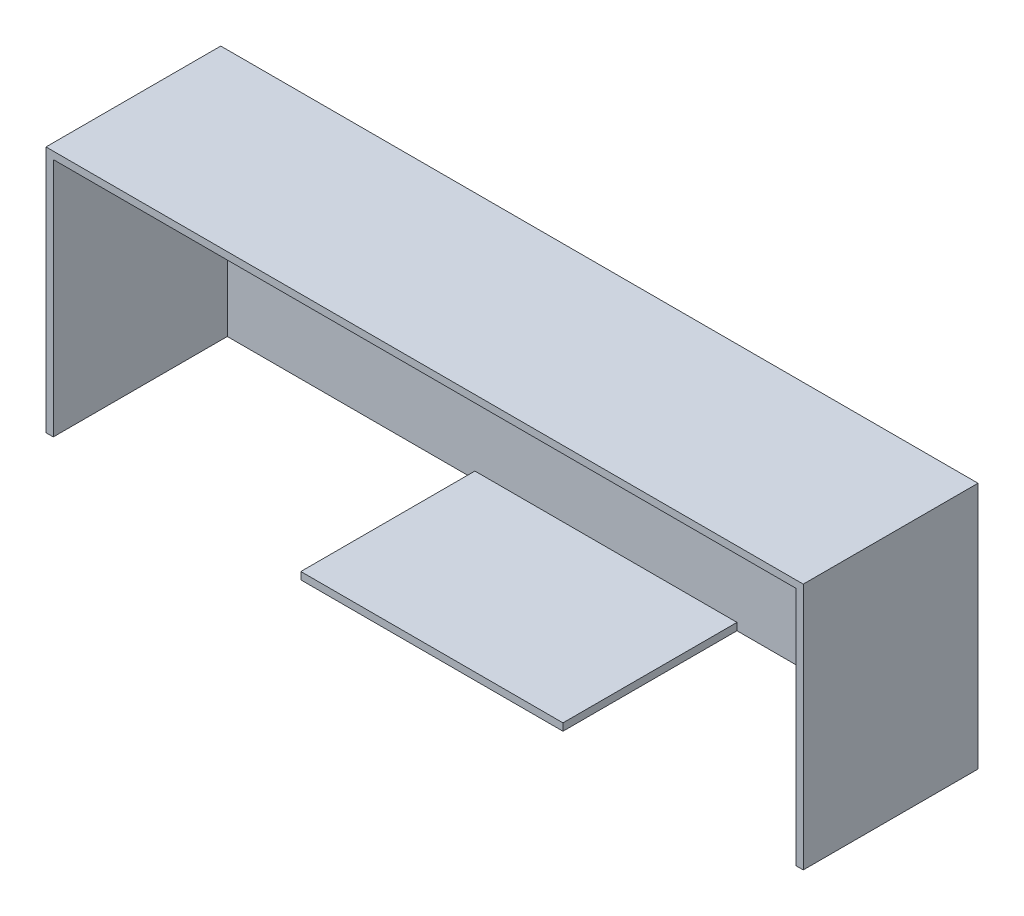
ISO-10303-21;
HEADER;
FILE_DESCRIPTION(('STEP AP214'),'2;1');
FILE_NAME('part.step','',(''),(''),'','','');
FILE_SCHEMA(('AUTOMOTIVE_DESIGN { 1 0 10303 214 1 1 1 1 }'));
ENDSEC;
DATA;
#1=APPLICATION_CONTEXT('core data for automotive mechanical design processes');
#2=APPLICATION_PROTOCOL_DEFINITION('international standard','automotive_design',2000,#1);
#3=PRODUCT_CONTEXT('',#1,'mechanical');
#4=PRODUCT('Part','Part','',(#3));
#5=PRODUCT_RELATED_PRODUCT_CATEGORY('part','',(#4));
#6=PRODUCT_DEFINITION_FORMATION('','',#4);
#7=PRODUCT_DEFINITION_CONTEXT('part definition',#1,'design');
#8=PRODUCT_DEFINITION('design','',#6,#7);
#9=PRODUCT_DEFINITION_SHAPE('','',#8);
#10=(LENGTH_UNIT() NAMED_UNIT(*) SI_UNIT(.MILLI.,.METRE.));
#11=(NAMED_UNIT(*) PLANE_ANGLE_UNIT() SI_UNIT($,.RADIAN.));
#12=(NAMED_UNIT(*) SI_UNIT($,.STERADIAN.) SOLID_ANGLE_UNIT());
#13=UNCERTAINTY_MEASURE_WITH_UNIT(LENGTH_MEASURE(1.E-05),#10,'distance_accuracy_value','');
#14=(GEOMETRIC_REPRESENTATION_CONTEXT(3) GLOBAL_UNCERTAINTY_ASSIGNED_CONTEXT((#13)) GLOBAL_UNIT_ASSIGNED_CONTEXT((#10,
#11,#12)) REPRESENTATION_CONTEXT('',''));
#15=CARTESIAN_POINT('',(0.,0.,0.));
#16=DIRECTION('',(0.,0.,1.));
#17=DIRECTION('',(1.,0.,0.));
#18=AXIS2_PLACEMENT_3D('',#15,#16,#17);
#19=CARTESIAN_POINT('',(0.,0.,0.635));
#20=DIRECTION('',(0.,0.,-1.));
#21=DIRECTION('',(-1.,0.,0.));
#22=AXIS2_PLACEMENT_3D('',#19,#20,#21);
#23=PLANE('',#22);
#24=DIRECTION('',(0.,1.,0.));
#25=VECTOR('',#24,1.);
#26=CARTESIAN_POINT('',(356.8048716838,0.,0.635));
#27=LINE('',#26,#25);
#28=CARTESIAN_POINT('',(356.8048716838,-209.55,0.635000000000052));
#29=VERTEX_POINT('',#28);
#30=CARTESIAN_POINT('',(356.8048716838,-203.2,0.635000000000052));
#31=VERTEX_POINT('',#30);
#32=EDGE_CURVE('E12',#29,#31,#27,.T.);
#33=ORIENTED_EDGE('',*,*,#32,.F.);
#34=DIRECTION('',(-1.,0.,0.));
#35=VECTOR('',#34,1.);
#36=CARTESIAN_POINT('',(560.0048716838,-209.55,0.635));
#37=LINE('',#36,#35);
#38=CARTESIAN_POINT('',(560.0048716838,-209.55,0.635));
#39=VERTEX_POINT('',#38);
#40=EDGE_CURVE('E182',#39,#29,#37,.T.);
#41=ORIENTED_EDGE('',*,*,#40,.F.);
#42=DIRECTION('',(0.,-1.,0.));
#43=VECTOR('',#42,1.);
#44=CARTESIAN_POINT('',(560.0048716838,-209.55,0.635));
#45=LINE('',#44,#43);
#46=CARTESIAN_POINT('',(560.0048716838,0.,0.635));
#47=VERTEX_POINT('',#46);
#48=EDGE_CURVE('E258',#47,#39,#45,.T.);
#49=ORIENTED_EDGE('',*,*,#48,.F.);
#50=DIRECTION('',(1.,0.,0.));
#51=VECTOR('',#50,1.);
#52=CARTESIAN_POINT('',(-87.6951283161997,0.,0.635));
#53=LINE('',#52,#51);
#54=CARTESIAN_POINT('',(-87.6951283161997,0.,0.635));
#55=VERTEX_POINT('',#54);
#56=EDGE_CURVE('E254',#55,#47,#53,.T.);
#57=ORIENTED_EDGE('',*,*,#56,.F.);
#58=DIRECTION('',(0.,1.,0.));
#59=VECTOR('',#58,1.);
#60=CARTESIAN_POINT('',(-87.6951283161997,-209.55,0.635));
#61=LINE('',#60,#59);
#62=CARTESIAN_POINT('',(-87.6951283161997,-209.55,0.635));
#63=VERTEX_POINT('',#62);
#64=EDGE_CURVE('E245',#63,#55,#61,.T.);
#65=ORIENTED_EDGE('',*,*,#64,.F.);
#66=CARTESIAN_POINT('',(128.2048716838,-209.55,0.635000000000052));
#67=VERTEX_POINT('',#66);
#68=EDGE_CURVE('E262',#67,#63,#37,.T.);
#69=ORIENTED_EDGE('',*,*,#68,.F.);
#70=DIRECTION('',(0.,1.,0.));
#71=VECTOR('',#70,1.);
#72=CARTESIAN_POINT('',(128.2048716838,0.,0.635));
#73=LINE('',#72,#71);
#74=CARTESIAN_POINT('',(128.2048716838,-203.2,0.635));
#75=VERTEX_POINT('',#74);
#76=EDGE_CURVE('E213',#67,#75,#73,.T.);
#77=ORIENTED_EDGE('',*,*,#76,.T.);
#78=DIRECTION('',(1.,0.,0.));
#79=VECTOR('',#78,1.);
#80=CARTESIAN_POINT('',(0.,-203.2,0.635));
#81=LINE('',#80,#79);
#82=EDGE_CURVE('E86',#75,#31,#81,.T.);
#83=ORIENTED_EDGE('',*,*,#82,.T.);
#84=EDGE_LOOP('',(#33,#41,#49,#57,#65,#69,#77,#83));
#85=FACE_BOUND('',#84,.T.);
#86=ADVANCED_FACE('F77',(#85),#23,.F.);
#87=CARTESIAN_POINT('',(-87.6951283161997,0.,152.4));
#88=DIRECTION('',(1.,0.,0.));
#89=DIRECTION('',(0.,1.,0.));
#90=AXIS2_PLACEMENT_3D('',#87,#88,#89);
#91=PLANE('',#90);
#92=DIRECTION('',(0.,0.,-1.));
#93=VECTOR('',#92,1.);
#94=CARTESIAN_POINT('',(-87.6951283161997,-209.55,152.4));
#95=LINE('',#94,#93);
#96=CARTESIAN_POINT('',(-87.6951283161997,-209.55,152.4));
#97=VERTEX_POINT('',#96);
#98=EDGE_CURVE('E207',#97,#63,#95,.T.);
#99=ORIENTED_EDGE('',*,*,#98,.T.);
#100=ORIENTED_EDGE('',*,*,#64,.T.);
#101=DIRECTION('',(0.,0.,-1.));
#102=VECTOR('',#101,1.);
#103=CARTESIAN_POINT('',(-87.6951283161997,0.,152.4));
#104=LINE('',#103,#102);
#105=CARTESIAN_POINT('',(-87.6951283161997,0.,152.4));
#106=VERTEX_POINT('',#105);
#107=EDGE_CURVE('E203',#106,#55,#104,.T.);
#108=ORIENTED_EDGE('',*,*,#107,.F.);
#109=DIRECTION('',(0.,-1.,0.));
#110=VECTOR('',#109,1.);
#111=CARTESIAN_POINT('',(-87.6951283161997,0.,152.4));
#112=LINE('',#111,#110);
#113=EDGE_CURVE('E271',#106,#97,#112,.T.);
#114=ORIENTED_EDGE('',*,*,#113,.T.);
#115=EDGE_LOOP('',(#99,#100,#108,#114));
#116=FACE_BOUND('',#115,.T.);
#117=ADVANCED_FACE('F291',(#116),#91,.T.);
#118=CARTESIAN_POINT('',(0.,0.,152.4));
#119=DIRECTION('',(0.,-1.,0.));
#120=DIRECTION('',(1.,0.,0.));
#121=AXIS2_PLACEMENT_3D('',#118,#119,#120);
#122=PLANE('',#121);
#123=ORIENTED_EDGE('',*,*,#107,.T.);
#124=ORIENTED_EDGE('',*,*,#56,.T.);
#125=DIRECTION('',(0.,0.,-1.));
#126=VECTOR('',#125,1.);
#127=CARTESIAN_POINT('',(560.0048716838,0.,152.4));
#128=LINE('',#127,#126);
#129=CARTESIAN_POINT('',(560.0048716838,0.,152.4));
#130=VERTEX_POINT('',#129);
#131=EDGE_CURVE('E199',#130,#47,#128,.T.);
#132=ORIENTED_EDGE('',*,*,#131,.F.);
#133=DIRECTION('',(-1.,0.,0.));
#134=VECTOR('',#133,1.);
#135=CARTESIAN_POINT('',(0.,0.,152.4));
#136=LINE('',#135,#134);
#137=EDGE_CURVE('E275',#130,#106,#136,.T.);
#138=ORIENTED_EDGE('',*,*,#137,.T.);
#139=EDGE_LOOP('',(#123,#124,#132,#138));
#140=FACE_BOUND('',#139,.T.);
#141=ADVANCED_FACE('F294',(#140),#122,.T.);
#142=CARTESIAN_POINT('',(560.0048716838,0.,152.4));
#143=DIRECTION('',(1.,0.,0.));
#144=DIRECTION('',(0.,0.,-1.));
#145=AXIS2_PLACEMENT_3D('',#142,#143,#144);
#146=PLANE('',#145);
#147=ORIENTED_EDGE('',*,*,#48,.T.);
#148=DIRECTION('',(0.,0.,-1.));
#149=VECTOR('',#148,1.);
#150=CARTESIAN_POINT('',(560.0048716838,-209.55,152.4));
#151=LINE('',#150,#149);
#152=CARTESIAN_POINT('',(560.0048716838,-209.55,152.4));
#153=VERTEX_POINT('',#152);
#154=EDGE_CURVE('E168',#153,#39,#151,.T.);
#155=ORIENTED_EDGE('',*,*,#154,.F.);
#156=DIRECTION('',(0.,-1.,0.));
#157=VECTOR('',#156,1.);
#158=CARTESIAN_POINT('',(560.0048716838,0.,152.4));
#159=LINE('',#158,#157);
#160=EDGE_CURVE('E154',#130,#153,#159,.T.);
#161=ORIENTED_EDGE('',*,*,#160,.F.);
#162=ORIENTED_EDGE('',*,*,#131,.T.);
#163=EDGE_LOOP('',(#147,#155,#161,#162));
#164=FACE_BOUND('',#163,.T.);
#165=ADVANCED_FACE('F297',(#164),#146,.F.);
#166=CARTESIAN_POINT('',(-94.0451283161997,0.,152.4));
#167=DIRECTION('',(-1.,0.,0.));
#168=DIRECTION('',(0.,0.,1.));
#169=AXIS2_PLACEMENT_3D('',#166,#167,#168);
#170=PLANE('',#169);
#171=DIRECTION('',(0.,1.,0.));
#172=VECTOR('',#171,1.);
#173=CARTESIAN_POINT('',(-94.0451283161997,0.,0.));
#174=LINE('',#173,#172);
#175=CARTESIAN_POINT('',(-94.0451283161997,-209.55,0.));
#176=VERTEX_POINT('',#175);
#177=CARTESIAN_POINT('',(-94.0451283161997,6.34999999999991,0.));
#178=VERTEX_POINT('',#177);
#179=EDGE_CURVE('E179',#176,#178,#174,.T.);
#180=ORIENTED_EDGE('',*,*,#179,.F.);
#181=DIRECTION('',(0.,0.,-1.));
#182=VECTOR('',#181,1.);
#183=CARTESIAN_POINT('',(-94.0451283161997,-209.55,152.4));
#184=LINE('',#183,#182);
#185=CARTESIAN_POINT('',(-94.0451283161997,-209.55,152.4));
#186=VERTEX_POINT('',#185);
#187=EDGE_CURVE('E127',#186,#176,#184,.T.);
#188=ORIENTED_EDGE('',*,*,#187,.F.);
#189=DIRECTION('',(0.,1.,0.));
#190=VECTOR('',#189,1.);
#191=CARTESIAN_POINT('',(-94.0451283161997,0.,152.4));
#192=LINE('',#191,#190);
#193=CARTESIAN_POINT('',(-94.0451283161997,6.34999999999991,152.4));
#194=VERTEX_POINT('',#193);
#195=EDGE_CURVE('E192',#186,#194,#192,.T.);
#196=ORIENTED_EDGE('',*,*,#195,.T.);
#197=DIRECTION('',(0.,0.,-1.));
#198=VECTOR('',#197,1.);
#199=CARTESIAN_POINT('',(-94.0451283161997,6.34999999999991,152.4));
#200=LINE('',#199,#198);
#201=EDGE_CURVE('E102',#194,#178,#200,.T.);
#202=ORIENTED_EDGE('',*,*,#201,.T.);
#203=EDGE_LOOP('',(#180,#188,#196,#202));
#204=FACE_BOUND('',#203,.T.);
#205=ADVANCED_FACE('F79',(#204),#170,.T.);
#206=CARTESIAN_POINT('',(-9.15933995315748E-13,-209.549999999998,152.4));
#207=DIRECTION('',(0.,1.,0.));
#208=DIRECTION('',(-1.,0.,0.));
#209=AXIS2_PLACEMENT_3D('',#206,#207,#208);
#210=PLANE('',#209);
#211=DIRECTION('',(1.,0.,0.));
#212=VECTOR('',#211,1.);
#213=CARTESIAN_POINT('',(-9.15933995315748E-13,-209.549999999998,0.));
#214=LINE('',#213,#212);
#215=CARTESIAN_POINT('',(566.3548716838,-209.55,0.));
#216=VERTEX_POINT('',#215);
#217=EDGE_CURVE('E163',#176,#216,#214,.T.);
#218=ORIENTED_EDGE('',*,*,#217,.T.);
#219=DIRECTION('',(0.,0.,-1.));
#220=VECTOR('',#219,1.);
#221=CARTESIAN_POINT('',(566.3548716838,-209.55,152.4));
#222=LINE('',#221,#220);
#223=CARTESIAN_POINT('',(566.3548716838,-209.55,152.4));
#224=VERTEX_POINT('',#223);
#225=EDGE_CURVE('E161',#224,#216,#222,.T.);
#226=ORIENTED_EDGE('',*,*,#225,.F.);
#227=DIRECTION('',(1.,0.,0.));
#228=VECTOR('',#227,1.);
#229=CARTESIAN_POINT('',(-9.15933995315748E-13,-209.549999999998,152.4));
#230=LINE('',#229,#228);
#231=EDGE_CURVE('E145',#153,#224,#230,.T.);
#232=ORIENTED_EDGE('',*,*,#231,.F.);
#233=ORIENTED_EDGE('',*,*,#154,.T.);
#234=ORIENTED_EDGE('',*,*,#40,.T.);
#235=DIRECTION('',(0.,0.,-1.));
#236=VECTOR('',#235,1.);
#237=CARTESIAN_POINT('',(356.8048716838,-209.55,152.4));
#238=LINE('',#237,#236);
#239=CARTESIAN_POINT('',(356.8048716838,-209.55,152.4));
#240=VERTEX_POINT('',#239);
#241=EDGE_CURVE('E240',#240,#29,#238,.T.);
#242=ORIENTED_EDGE('',*,*,#241,.F.);
#243=DIRECTION('',(1.,0.,0.));
#244=VECTOR('',#243,1.);
#245=CARTESIAN_POINT('',(0.,-209.55,152.4));
#246=LINE('',#245,#244);
#247=CARTESIAN_POINT('',(128.2048716838,-209.55,152.4));
#248=VERTEX_POINT('',#247);
#249=EDGE_CURVE('E315',#248,#240,#246,.T.);
#250=ORIENTED_EDGE('',*,*,#249,.F.);
#251=DIRECTION('',(0.,0.,-1.));
#252=VECTOR('',#251,1.);
#253=CARTESIAN_POINT('',(128.2048716838,-209.55,152.4));
#254=LINE('',#253,#252);
#255=EDGE_CURVE('E247',#248,#67,#254,.T.);
#256=ORIENTED_EDGE('',*,*,#255,.T.);
#257=ORIENTED_EDGE('',*,*,#68,.T.);
#258=ORIENTED_EDGE('',*,*,#98,.F.);
#259=DIRECTION('',(-1.,0.,0.));
#260=VECTOR('',#259,1.);
#261=CARTESIAN_POINT('',(0.,-209.55,152.4));
#262=LINE('',#261,#260);
#263=EDGE_CURVE('E267',#97,#186,#262,.T.);
#264=ORIENTED_EDGE('',*,*,#263,.T.);
#265=ORIENTED_EDGE('',*,*,#187,.T.);
#266=EDGE_LOOP('',(#218,#226,#232,#233,#234,#242,#250,#256,#257,#258,#264,#265));
#267=FACE_BOUND('',#266,.T.);
#268=ADVANCED_FACE('F162',(#267),#210,.F.);
#269=CARTESIAN_POINT('',(566.3548716838,0.,152.4));
#270=DIRECTION('',(-1.,0.,0.));
#271=DIRECTION('',(0.,0.,1.));
#272=AXIS2_PLACEMENT_3D('',#269,#270,#271);
#273=PLANE('',#272);
#274=DIRECTION('',(0.,1.,0.));
#275=VECTOR('',#274,1.);
#276=CARTESIAN_POINT('',(566.3548716838,0.,0.));
#277=LINE('',#276,#275);
#278=CARTESIAN_POINT('',(566.3548716838,6.34999999999994,0.));
#279=VERTEX_POINT('',#278);
#280=EDGE_CURVE('E185',#216,#279,#277,.T.);
#281=ORIENTED_EDGE('',*,*,#280,.T.);
#282=DIRECTION('',(0.,0.,-1.));
#283=VECTOR('',#282,1.);
#284=CARTESIAN_POINT('',(566.3548716838,6.34999999999994,152.4));
#285=LINE('',#284,#283);
#286=CARTESIAN_POINT('',(566.3548716838,6.34999999999994,152.4));
#287=VERTEX_POINT('',#286);
#288=EDGE_CURVE('E169',#287,#279,#285,.T.);
#289=ORIENTED_EDGE('',*,*,#288,.F.);
#290=DIRECTION('',(0.,1.,0.));
#291=VECTOR('',#290,1.);
#292=CARTESIAN_POINT('',(566.3548716838,0.,152.4));
#293=LINE('',#292,#291);
#294=EDGE_CURVE('E150',#224,#287,#293,.T.);
#295=ORIENTED_EDGE('',*,*,#294,.F.);
#296=ORIENTED_EDGE('',*,*,#225,.T.);
#297=EDGE_LOOP('',(#281,#289,#295,#296));
#298=FACE_BOUND('',#297,.T.);
#299=ADVANCED_FACE('F171',(#298),#273,.F.);
#300=CARTESIAN_POINT('',(0.,6.34999999999992,152.4));
#301=DIRECTION('',(0.,1.,0.));
#302=DIRECTION('',(-1.,0.,0.));
#303=AXIS2_PLACEMENT_3D('',#300,#301,#302);
#304=PLANE('',#303);
#305=DIRECTION('',(1.,0.,0.));
#306=VECTOR('',#305,1.);
#307=CARTESIAN_POINT('',(0.,6.34999999999992,0.));
#308=LINE('',#307,#306);
#309=EDGE_CURVE('E188',#178,#279,#308,.T.);
#310=ORIENTED_EDGE('',*,*,#309,.F.);
#311=ORIENTED_EDGE('',*,*,#201,.F.);
#312=DIRECTION('',(1.,0.,0.));
#313=VECTOR('',#312,1.);
#314=CARTESIAN_POINT('',(0.,6.34999999999992,152.4));
#315=LINE('',#314,#313);
#316=EDGE_CURVE('E173',#194,#287,#315,.T.);
#317=ORIENTED_EDGE('',*,*,#316,.T.);
#318=ORIENTED_EDGE('',*,*,#288,.T.);
#319=EDGE_LOOP('',(#310,#311,#317,#318));
#320=FACE_BOUND('',#319,.T.);
#321=ADVANCED_FACE('F346',(#320),#304,.T.);
#322=CARTESIAN_POINT('',(0.,0.,152.4));
#323=DIRECTION('',(0.,0.,1.));
#324=DIRECTION('',(1.,0.,0.));
#325=AXIS2_PLACEMENT_3D('',#322,#323,#324);
#326=PLANE('',#325);
#327=ORIENTED_EDGE('',*,*,#195,.F.);
#328=ORIENTED_EDGE('',*,*,#263,.F.);
#329=ORIENTED_EDGE('',*,*,#113,.F.);
#330=ORIENTED_EDGE('',*,*,#137,.F.);
#331=ORIENTED_EDGE('',*,*,#160,.T.);
#332=ORIENTED_EDGE('',*,*,#231,.T.);
#333=ORIENTED_EDGE('',*,*,#294,.T.);
#334=ORIENTED_EDGE('',*,*,#316,.F.);
#335=EDGE_LOOP('',(#327,#328,#329,#330,#331,#332,#333,#334));
#336=FACE_BOUND('',#335,.T.);
#337=ADVANCED_FACE('F147',(#336),#326,.T.);
#338=CARTESIAN_POINT('',(0.,0.,0.));
#339=DIRECTION('',(0.,0.,1.));
#340=DIRECTION('',(1.,0.,0.));
#341=AXIS2_PLACEMENT_3D('',#338,#339,#340);
#342=PLANE('',#341);
#343=ORIENTED_EDGE('',*,*,#280,.F.);
#344=ORIENTED_EDGE('',*,*,#217,.F.);
#345=ORIENTED_EDGE('',*,*,#179,.T.);
#346=ORIENTED_EDGE('',*,*,#309,.T.);
#347=EDGE_LOOP('',(#343,#344,#345,#346));
#348=FACE_BOUND('',#347,.T.);
#349=ADVANCED_FACE('F345',(#348),#342,.F.);
#350=CARTESIAN_POINT('',(356.8048716838,0.,152.4));
#351=DIRECTION('',(-1.,0.,0.));
#352=DIRECTION('',(0.,0.,1.));
#353=AXIS2_PLACEMENT_3D('',#350,#351,#352);
#354=PLANE('',#353);
#355=ORIENTED_EDGE('',*,*,#241,.T.);
#356=ORIENTED_EDGE('',*,*,#32,.T.);
#357=DIRECTION('',(0.,0.,-1.));
#358=VECTOR('',#357,1.);
#359=CARTESIAN_POINT('',(356.8048716838,-203.2,152.4));
#360=LINE('',#359,#358);
#361=CARTESIAN_POINT('',(356.8048716838,-203.2,152.4));
#362=VERTEX_POINT('',#361);
#363=EDGE_CURVE('E234',#362,#31,#360,.T.);
#364=ORIENTED_EDGE('',*,*,#363,.F.);
#365=DIRECTION('',(0.,1.,0.));
#366=VECTOR('',#365,1.);
#367=CARTESIAN_POINT('',(356.8048716838,0.,152.4));
#368=LINE('',#367,#366);
#369=EDGE_CURVE('E310',#240,#362,#368,.T.);
#370=ORIENTED_EDGE('',*,*,#369,.F.);
#371=EDGE_LOOP('',(#355,#356,#364,#370));
#372=FACE_BOUND('',#371,.T.);
#373=ADVANCED_FACE('F312',(#372),#354,.F.);
#374=CARTESIAN_POINT('',(0.,-203.2,152.4));
#375=DIRECTION('',(0.,1.,0.));
#376=DIRECTION('',(-1.,0.,0.));
#377=AXIS2_PLACEMENT_3D('',#374,#375,#376);
#378=PLANE('',#377);
#379=ORIENTED_EDGE('',*,*,#82,.F.);
#380=DIRECTION('',(0.,0.,-1.));
#381=VECTOR('',#380,1.);
#382=CARTESIAN_POINT('',(128.2048716838,-203.2,152.4));
#383=LINE('',#382,#381);
#384=CARTESIAN_POINT('',(128.2048716838,-203.2,152.4));
#385=VERTEX_POINT('',#384);
#386=EDGE_CURVE('E93',#385,#75,#383,.T.);
#387=ORIENTED_EDGE('',*,*,#386,.F.);
#388=DIRECTION('',(1.,0.,0.));
#389=VECTOR('',#388,1.);
#390=CARTESIAN_POINT('',(0.,-203.2,152.4));
#391=LINE('',#390,#389);
#392=EDGE_CURVE('E236',#385,#362,#391,.T.);
#393=ORIENTED_EDGE('',*,*,#392,.T.);
#394=ORIENTED_EDGE('',*,*,#363,.T.);
#395=EDGE_LOOP('',(#379,#387,#393,#394));
#396=FACE_BOUND('',#395,.T.);
#397=ADVANCED_FACE('F229',(#396),#378,.T.);
#398=CARTESIAN_POINT('',(128.2048716838,0.,152.4));
#399=DIRECTION('',(-1.,0.,0.));
#400=DIRECTION('',(0.,0.,1.));
#401=AXIS2_PLACEMENT_3D('',#398,#399,#400);
#402=PLANE('',#401);
#403=ORIENTED_EDGE('',*,*,#76,.F.);
#404=ORIENTED_EDGE('',*,*,#255,.F.);
#405=DIRECTION('',(0.,1.,0.));
#406=VECTOR('',#405,1.);
#407=CARTESIAN_POINT('',(128.2048716838,0.,152.4));
#408=LINE('',#407,#406);
#409=EDGE_CURVE('E319',#248,#385,#408,.T.);
#410=ORIENTED_EDGE('',*,*,#409,.T.);
#411=ORIENTED_EDGE('',*,*,#386,.T.);
#412=EDGE_LOOP('',(#403,#404,#410,#411));
#413=FACE_BOUND('',#412,.T.);
#414=ADVANCED_FACE('F327',(#413),#402,.T.);
#415=CARTESIAN_POINT('',(0.,0.,152.4));
#416=DIRECTION('',(0.,0.,1.));
#417=DIRECTION('',(1.,0.,0.));
#418=AXIS2_PLACEMENT_3D('',#415,#416,#417);
#419=PLANE('',#418);
#420=ORIENTED_EDGE('',*,*,#249,.T.);
#421=ORIENTED_EDGE('',*,*,#369,.T.);
#422=ORIENTED_EDGE('',*,*,#392,.F.);
#423=ORIENTED_EDGE('',*,*,#409,.F.);
#424=EDGE_LOOP('',(#420,#421,#422,#423));
#425=FACE_BOUND('',#424,.T.);
#426=ADVANCED_FACE('F318',(#425),#419,.T.);
#427=CLOSED_SHELL('',(#86,#117,#141,#165,#205,#268,#299,#321,#337,#349,#373,#397,#414,#426));
#428=MANIFOLD_SOLID_BREP('B2',#427);
#429=ADVANCED_BREP_SHAPE_REPRESENTATION('',(#18,#428),#14);
#430=SHAPE_DEFINITION_REPRESENTATION(#9,#429);
ENDSEC;
END-ISO-10303-21;
